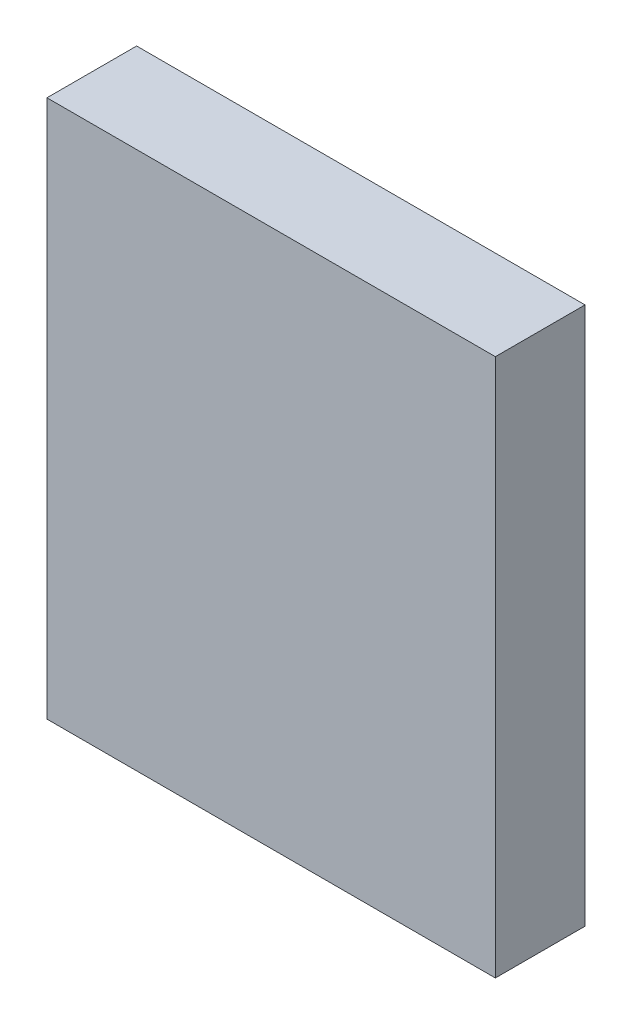
ISO-10303-21;
HEADER;
FILE_DESCRIPTION(('STEP AP214'),'2;1');
FILE_NAME('part.step','',(''),(''),'','','');
FILE_SCHEMA(('AUTOMOTIVE_DESIGN { 1 0 10303 214 1 1 1 1 }'));
ENDSEC;
DATA;
#1=APPLICATION_CONTEXT('core data for automotive mechanical design processes');
#2=APPLICATION_PROTOCOL_DEFINITION('international standard','automotive_design',2000,#1);
#3=PRODUCT_CONTEXT('',#1,'mechanical');
#4=PRODUCT('Part','Part','',(#3));
#5=PRODUCT_RELATED_PRODUCT_CATEGORY('part','',(#4));
#6=PRODUCT_DEFINITION_FORMATION('','',#4);
#7=PRODUCT_DEFINITION_CONTEXT('part definition',#1,'design');
#8=PRODUCT_DEFINITION('design','',#6,#7);
#9=PRODUCT_DEFINITION_SHAPE('','',#8);
#10=(LENGTH_UNIT() NAMED_UNIT(*) SI_UNIT(.MILLI.,.METRE.));
#11=(NAMED_UNIT(*) PLANE_ANGLE_UNIT() SI_UNIT($,.RADIAN.));
#12=(NAMED_UNIT(*) SI_UNIT($,.STERADIAN.) SOLID_ANGLE_UNIT());
#13=UNCERTAINTY_MEASURE_WITH_UNIT(LENGTH_MEASURE(1.E-05),#10,'distance_accuracy_value','');
#14=(GEOMETRIC_REPRESENTATION_CONTEXT(3) GLOBAL_UNCERTAINTY_ASSIGNED_CONTEXT((#13)) GLOBAL_UNIT_ASSIGNED_CONTEXT((#10,
#11,#12)) REPRESENTATION_CONTEXT('',''));
#15=CARTESIAN_POINT('',(0.,0.,0.));
#16=DIRECTION('',(0.,0.,1.));
#17=DIRECTION('',(1.,0.,0.));
#18=AXIS2_PLACEMENT_3D('',#15,#16,#17);
#19=CARTESIAN_POINT('',(2.50000008,3.00000162,1.));
#20=DIRECTION('',(0.,0.,-1.));
#21=DIRECTION('',(-1.,0.,0.));
#22=AXIS2_PLACEMENT_3D('',#19,#20,#21);
#23=PLANE('',#22);
#24=DIRECTION('',(0.,1.,0.));
#25=VECTOR('',#24,1.);
#26=CARTESIAN_POINT('',(-2.50000008,3.00000162,1.));
#27=LINE('',#26,#25);
#28=CARTESIAN_POINT('',(-2.50000008,3.00000162,1.));
#29=VERTEX_POINT('',#28);
#30=CARTESIAN_POINT('',(-2.50000008,-2.99999908,1.));
#31=VERTEX_POINT('',#30);
#32=EDGE_CURVE('E55',#29,#31,#27,.F.);
#33=ORIENTED_EDGE('',*,*,#32,.T.);
#34=DIRECTION('',(1.,0.,0.));
#35=VECTOR('',#34,1.);
#36=CARTESIAN_POINT('',(-2.50000008,-2.99999908,1.));
#37=LINE('',#36,#35);
#38=CARTESIAN_POINT('',(2.50000008,-2.99999908,1.));
#39=VERTEX_POINT('',#38);
#40=EDGE_CURVE('E57',#31,#39,#37,.T.);
#41=ORIENTED_EDGE('',*,*,#40,.T.);
#42=DIRECTION('',(0.,1.,0.));
#43=VECTOR('',#42,1.);
#44=CARTESIAN_POINT('',(2.50000008,-2.99999908,1.));
#45=LINE('',#44,#43);
#46=CARTESIAN_POINT('',(2.50000008,3.00000162,1.));
#47=VERTEX_POINT('',#46);
#48=EDGE_CURVE('E20',#39,#47,#45,.T.);
#49=ORIENTED_EDGE('',*,*,#48,.T.);
#50=DIRECTION('',(1.,0.,0.));
#51=VECTOR('',#50,1.);
#52=CARTESIAN_POINT('',(2.50000008,3.00000162,1.));
#53=LINE('',#52,#51);
#54=EDGE_CURVE('E80',#47,#29,#53,.F.);
#55=ORIENTED_EDGE('',*,*,#54,.T.);
#56=EDGE_LOOP('',(#33,#41,#49,#55));
#57=FACE_BOUND('',#56,.T.);
#58=ADVANCED_FACE('F17',(#57),#23,.F.);
#59=CARTESIAN_POINT('',(2.50000008,-2.99999908,0.));
#60=DIRECTION('',(-1.,0.,0.));
#61=DIRECTION('',(0.,0.,1.));
#62=AXIS2_PLACEMENT_3D('',#59,#60,#61);
#63=PLANE('',#62);
#64=DIRECTION('',(0.,0.,-1.));
#65=VECTOR('',#64,1.);
#66=CARTESIAN_POINT('',(2.50000008,3.00000162,0.));
#67=LINE('',#66,#65);
#68=CARTESIAN_POINT('',(2.50000008,3.00000162,0.));
#69=VERTEX_POINT('',#68);
#70=EDGE_CURVE('E68',#69,#47,#67,.F.);
#71=ORIENTED_EDGE('',*,*,#70,.T.);
#72=ORIENTED_EDGE('',*,*,#48,.F.);
#73=DIRECTION('',(0.,0.,1.));
#74=VECTOR('',#73,1.);
#75=CARTESIAN_POINT('',(2.50000008,-2.99999908,0.));
#76=LINE('',#75,#74);
#77=CARTESIAN_POINT('',(2.50000008,-2.99999908,0.));
#78=VERTEX_POINT('',#77);
#79=EDGE_CURVE('E63',#39,#78,#76,.F.);
#80=ORIENTED_EDGE('',*,*,#79,.T.);
#81=DIRECTION('',(0.,1.,0.));
#82=VECTOR('',#81,1.);
#83=CARTESIAN_POINT('',(2.50000008,3.00000162,0.));
#84=LINE('',#83,#82);
#85=EDGE_CURVE('E83',#69,#78,#84,.F.);
#86=ORIENTED_EDGE('',*,*,#85,.F.);
#87=EDGE_LOOP('',(#71,#72,#80,#86));
#88=FACE_BOUND('',#87,.T.);
#89=ADVANCED_FACE('F65',(#88),#63,.F.);
#90=CARTESIAN_POINT('',(-2.50000008,-2.99999908,0.));
#91=DIRECTION('',(0.,1.,0.));
#92=DIRECTION('',(0.,0.,1.));
#93=AXIS2_PLACEMENT_3D('',#90,#91,#92);
#94=PLANE('',#93);
#95=ORIENTED_EDGE('',*,*,#79,.F.);
#96=ORIENTED_EDGE('',*,*,#40,.F.);
#97=DIRECTION('',(0.,0.,-1.));
#98=VECTOR('',#97,1.);
#99=CARTESIAN_POINT('',(-2.50000008,-2.99999908,0.));
#100=LINE('',#99,#98);
#101=CARTESIAN_POINT('',(-2.50000008,-2.99999908,0.));
#102=VERTEX_POINT('',#101);
#103=EDGE_CURVE('E75',#31,#102,#100,.T.);
#104=ORIENTED_EDGE('',*,*,#103,.T.);
#105=DIRECTION('',(-1.,0.,0.));
#106=VECTOR('',#105,1.);
#107=CARTESIAN_POINT('',(2.50000008,-2.99999908,0.));
#108=LINE('',#107,#106);
#109=EDGE_CURVE('E72',#78,#102,#108,.T.);
#110=ORIENTED_EDGE('',*,*,#109,.F.);
#111=EDGE_LOOP('',(#95,#96,#104,#110));
#112=FACE_BOUND('',#111,.T.);
#113=ADVANCED_FACE('F70',(#112),#94,.F.);
#114=CARTESIAN_POINT('',(-2.50000008,3.00000162,0.));
#115=DIRECTION('',(1.,0.,0.));
#116=DIRECTION('',(0.,0.,-1.));
#117=AXIS2_PLACEMENT_3D('',#114,#115,#116);
#118=PLANE('',#117);
#119=ORIENTED_EDGE('',*,*,#103,.F.);
#120=ORIENTED_EDGE('',*,*,#32,.F.);
#121=DIRECTION('',(0.,0.,-1.));
#122=VECTOR('',#121,1.);
#123=CARTESIAN_POINT('',(-2.50000008,3.00000162,0.));
#124=LINE('',#123,#122);
#125=CARTESIAN_POINT('',(-2.50000008,3.00000162,0.));
#126=VERTEX_POINT('',#125);
#127=EDGE_CURVE('E35',#29,#126,#124,.T.);
#128=ORIENTED_EDGE('',*,*,#127,.T.);
#129=DIRECTION('',(0.,1.,0.));
#130=VECTOR('',#129,1.);
#131=CARTESIAN_POINT('',(-2.50000008,3.00000162,0.));
#132=LINE('',#131,#130);
#133=EDGE_CURVE('E26',#102,#126,#132,.T.);
#134=ORIENTED_EDGE('',*,*,#133,.F.);
#135=EDGE_LOOP('',(#119,#120,#128,#134));
#136=FACE_BOUND('',#135,.T.);
#137=ADVANCED_FACE('F89',(#136),#118,.F.);
#138=CARTESIAN_POINT('',(2.50000008,3.00000162,0.));
#139=DIRECTION('',(0.,-1.,0.));
#140=DIRECTION('',(0.,0.,-1.));
#141=AXIS2_PLACEMENT_3D('',#138,#139,#140);
#142=PLANE('',#141);
#143=ORIENTED_EDGE('',*,*,#127,.F.);
#144=ORIENTED_EDGE('',*,*,#54,.F.);
#145=ORIENTED_EDGE('',*,*,#70,.F.);
#146=DIRECTION('',(-1.,0.,0.));
#147=VECTOR('',#146,1.);
#148=CARTESIAN_POINT('',(2.50000008,3.00000162,0.));
#149=LINE('',#148,#147);
#150=EDGE_CURVE('E11',#126,#69,#149,.F.);
#151=ORIENTED_EDGE('',*,*,#150,.F.);
#152=EDGE_LOOP('',(#143,#144,#145,#151));
#153=FACE_BOUND('',#152,.T.);
#154=ADVANCED_FACE('F91',(#153),#142,.F.);
#155=CARTESIAN_POINT('',(2.50000008,3.00000162,0.));
#156=DIRECTION('',(0.,0.,-1.));
#157=DIRECTION('',(-1.,0.,0.));
#158=AXIS2_PLACEMENT_3D('',#155,#156,#157);
#159=PLANE('',#158);
#160=ORIENTED_EDGE('',*,*,#133,.T.);
#161=ORIENTED_EDGE('',*,*,#150,.T.);
#162=ORIENTED_EDGE('',*,*,#85,.T.);
#163=ORIENTED_EDGE('',*,*,#109,.T.);
#164=EDGE_LOOP('',(#160,#161,#162,#163));
#165=FACE_BOUND('',#164,.T.);
#166=ADVANCED_FACE('F88',(#165),#159,.T.);
#167=CLOSED_SHELL('',(#58,#89,#113,#137,#154,#166));
#168=MANIFOLD_SOLID_BREP('B1',#167);
#169=ADVANCED_BREP_SHAPE_REPRESENTATION('',(#18,#168),#14);
#170=SHAPE_DEFINITION_REPRESENTATION(#9,#169);
ENDSEC;
END-ISO-10303-21;
